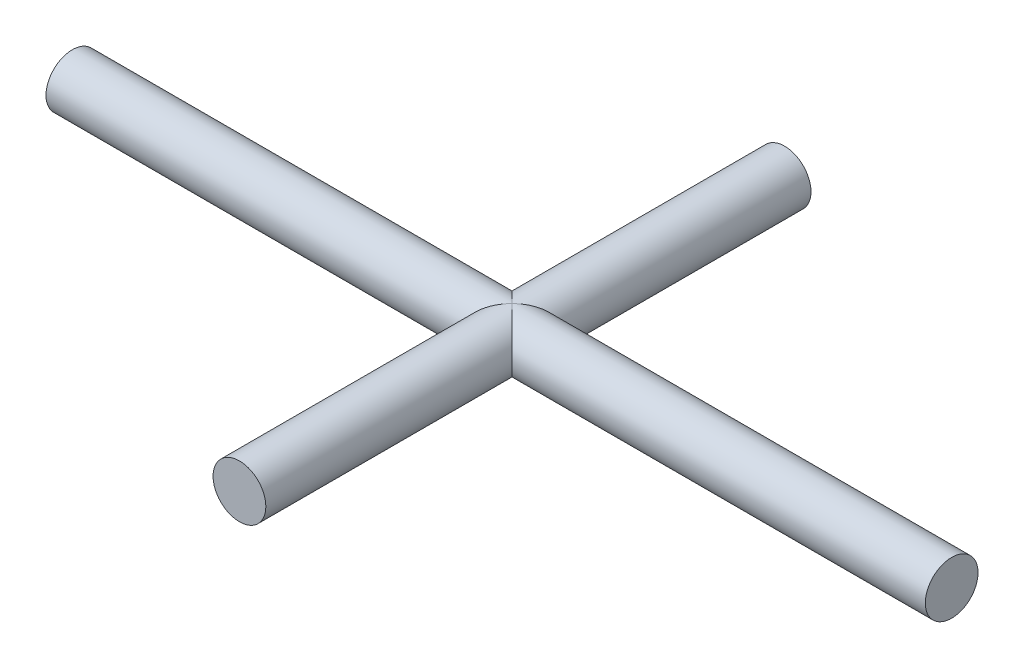
ISO-10303-21;
HEADER;
FILE_DESCRIPTION(('STEP AP214'),'2;1');
FILE_NAME('part.step','',(''),(''),'','','');
FILE_SCHEMA(('AUTOMOTIVE_DESIGN { 1 0 10303 214 1 1 1 1 }'));
ENDSEC;
DATA;
#1=APPLICATION_CONTEXT('core data for automotive mechanical design processes');
#2=APPLICATION_PROTOCOL_DEFINITION('international standard','automotive_design',2000,#1);
#3=PRODUCT_CONTEXT('',#1,'mechanical');
#4=PRODUCT('Part','Part','',(#3));
#5=PRODUCT_RELATED_PRODUCT_CATEGORY('part','',(#4));
#6=PRODUCT_DEFINITION_FORMATION('','',#4);
#7=PRODUCT_DEFINITION_CONTEXT('part definition',#1,'design');
#8=PRODUCT_DEFINITION('design','',#6,#7);
#9=PRODUCT_DEFINITION_SHAPE('','',#8);
#10=(LENGTH_UNIT() NAMED_UNIT(*) SI_UNIT(.MILLI.,.METRE.));
#11=(NAMED_UNIT(*) PLANE_ANGLE_UNIT() SI_UNIT($,.RADIAN.));
#12=(NAMED_UNIT(*) SI_UNIT($,.STERADIAN.) SOLID_ANGLE_UNIT());
#13=UNCERTAINTY_MEASURE_WITH_UNIT(LENGTH_MEASURE(1.E-05),#10,'distance_accuracy_value','');
#14=(GEOMETRIC_REPRESENTATION_CONTEXT(3) GLOBAL_UNCERTAINTY_ASSIGNED_CONTEXT((#13)) GLOBAL_UNIT_ASSIGNED_CONTEXT((#10,
#11,#12)) REPRESENTATION_CONTEXT('',''));
#15=CARTESIAN_POINT('',(0.,0.,0.));
#16=DIRECTION('',(0.,0.,1.));
#17=DIRECTION('',(1.,0.,0.));
#18=AXIS2_PLACEMENT_3D('',#15,#16,#17);
#19=CARTESIAN_POINT('',(-50.,0.,0.));
#20=DIRECTION('',(-1.,0.,0.));
#21=DIRECTION('',(0.,0.,1.));
#22=AXIS2_PLACEMENT_3D('',#19,#20,#21);
#23=CYLINDRICAL_SURFACE('',#22,3.00000000000001);
#24=CARTESIAN_POINT('',(50.,0.,0.));
#25=DIRECTION('',(-1.,0.,0.));
#26=DIRECTION('',(0.,0.,1.));
#27=AXIS2_PLACEMENT_3D('',#24,#25,#26);
#28=CIRCLE('',#27,3.00000000000001);
#29=CARTESIAN_POINT('',(50.,0.,3.00000000000001));
#30=VERTEX_POINT('',#29);
#31=EDGE_CURVE('E58',#30,#30,#28,.T.);
#32=ORIENTED_EDGE('',*,*,#31,.T.);
#33=EDGE_LOOP('',(#32));
#34=FACE_BOUND('',#33,.T.);
#35=CARTESIAN_POINT('',(0.,0.,0.));
#36=DIRECTION('',(-0.707106781186547,0.,0.707106781186547));
#37=DIRECTION('',(-0.707106781186547,0.,-0.707106781186547));
#38=AXIS2_PLACEMENT_3D('',#35,#36,#37);
#39=ELLIPSE('',#38,4.24264068711929,3.);
#40=CARTESIAN_POINT('',(0.,-3.,0.));
#41=VERTEX_POINT('',#40);
#42=CARTESIAN_POINT('',(0.,3.,0.));
#43=VERTEX_POINT('',#42);
#44=EDGE_CURVE('E41',#41,#43,#39,.T.);
#45=ORIENTED_EDGE('',*,*,#44,.F.);
#46=CARTESIAN_POINT('',(0.,0.,0.));
#47=DIRECTION('',(-0.707106781186547,0.,-0.707106781186547));
#48=DIRECTION('',(-0.707106781186547,0.,0.707106781186547));
#49=AXIS2_PLACEMENT_3D('',#46,#47,#48);
#50=ELLIPSE('',#49,4.24264068711929,3.);
#51=EDGE_CURVE('E53',#43,#41,#50,.T.);
#52=ORIENTED_EDGE('',*,*,#51,.F.);
#53=EDGE_LOOP('',(#45,#52));
#54=FACE_BOUND('',#53,.T.);
#55=ADVANCED_FACE('F33',(#34,#54),#23,.T.);
#56=CARTESIAN_POINT('',(50.,0.,0.));
#57=DIRECTION('',(-1.,0.,0.));
#58=DIRECTION('',(0.,0.,1.));
#59=AXIS2_PLACEMENT_3D('',#56,#57,#58);
#60=PLANE('',#59);
#61=ORIENTED_EDGE('',*,*,#31,.F.);
#62=EDGE_LOOP('',(#61));
#63=FACE_BOUND('',#62,.T.);
#64=ADVANCED_FACE('F80',(#63),#60,.F.);
#65=CARTESIAN_POINT('',(0.,0.,31.));
#66=DIRECTION('',(0.,0.,1.));
#67=DIRECTION('',(1.,0.,0.));
#68=AXIS2_PLACEMENT_3D('',#65,#66,#67);
#69=PLANE('',#68);
#70=CARTESIAN_POINT('',(0.,0.,31.));
#71=DIRECTION('',(0.,0.,1.));
#72=DIRECTION('',(1.,0.,0.));
#73=AXIS2_PLACEMENT_3D('',#70,#71,#72);
#74=CIRCLE('',#73,3.);
#75=CARTESIAN_POINT('',(3.,0.,31.));
#76=VERTEX_POINT('',#75);
#77=EDGE_CURVE('E95',#76,#76,#74,.T.);
#78=ORIENTED_EDGE('',*,*,#77,.T.);
#79=EDGE_LOOP('',(#78));
#80=FACE_BOUND('',#79,.T.);
#81=ADVANCED_FACE('F77',(#80),#69,.T.);
#82=CARTESIAN_POINT('',(0.,0.,31.));
#83=DIRECTION('',(0.,0.,1.));
#84=DIRECTION('',(1.,0.,0.));
#85=AXIS2_PLACEMENT_3D('',#82,#83,#84);
#86=CYLINDRICAL_SURFACE('',#85,3.);
#87=ORIENTED_EDGE('',*,*,#77,.F.);
#88=EDGE_LOOP('',(#87));
#89=FACE_BOUND('',#88,.T.);
#90=CARTESIAN_POINT('',(0.,0.,0.));
#91=DIRECTION('',(-0.707106781186547,0.,-0.707106781186547));
#92=DIRECTION('',(-0.707106781186547,0.,0.707106781186547));
#93=AXIS2_PLACEMENT_3D('',#90,#91,#92);
#94=ELLIPSE('',#93,4.24264068711929,3.);
#95=EDGE_CURVE('E47',#43,#41,#94,.F.);
#96=ORIENTED_EDGE('',*,*,#95,.T.);
#97=ORIENTED_EDGE('',*,*,#44,.T.);
#98=EDGE_LOOP('',(#96,#97));
#99=FACE_BOUND('',#98,.T.);
#100=ADVANCED_FACE('F60',(#89,#99),#86,.T.);
#101=CARTESIAN_POINT('',(-50.,0.,0.));
#102=DIRECTION('',(1.,0.,0.));
#103=DIRECTION('',(0.,0.,-1.));
#104=AXIS2_PLACEMENT_3D('',#101,#102,#103);
#105=PLANE('',#104);
#106=CARTESIAN_POINT('',(-50.,0.,0.));
#107=DIRECTION('',(-1.,0.,0.));
#108=DIRECTION('',(0.,0.,1.));
#109=AXIS2_PLACEMENT_3D('',#106,#107,#108);
#110=CIRCLE('',#109,3.);
#111=CARTESIAN_POINT('',(-50.,0.,3.));
#112=VERTEX_POINT('',#111);
#113=EDGE_CURVE('E88',#112,#112,#110,.T.);
#114=ORIENTED_EDGE('',*,*,#113,.T.);
#115=EDGE_LOOP('',(#114));
#116=FACE_BOUND('',#115,.T.);
#117=ADVANCED_FACE('F35',(#116),#105,.F.);
#118=ORIENTED_EDGE('',*,*,#113,.F.);
#119=EDGE_LOOP('',(#118));
#120=FACE_BOUND('',#119,.T.);
#121=CARTESIAN_POINT('',(0.,0.,0.));
#122=DIRECTION('',(-0.707106781186547,0.,0.707106781186547));
#123=DIRECTION('',(-0.707106781186547,0.,-0.707106781186547));
#124=AXIS2_PLACEMENT_3D('',#121,#122,#123);
#125=ELLIPSE('',#124,4.24264068711929,3.);
#126=EDGE_CURVE('E11',#41,#43,#125,.F.);
#127=ORIENTED_EDGE('',*,*,#126,.F.);
#128=ORIENTED_EDGE('',*,*,#95,.F.);
#129=EDGE_LOOP('',(#127,#128));
#130=FACE_BOUND('',#129,.T.);
#131=ADVANCED_FACE('F57',(#120,#130),#23,.T.);
#132=CARTESIAN_POINT('',(0.,0.,-31.));
#133=DIRECTION('',(0.,0.,1.));
#134=DIRECTION('',(1.,0.,0.));
#135=AXIS2_PLACEMENT_3D('',#132,#133,#134);
#136=CIRCLE('',#135,3.);
#137=CARTESIAN_POINT('',(3.,0.,-31.));
#138=VERTEX_POINT('',#137);
#139=EDGE_CURVE('E91',#138,#138,#136,.T.);
#140=ORIENTED_EDGE('',*,*,#139,.T.);
#141=EDGE_LOOP('',(#140));
#142=FACE_BOUND('',#141,.T.);
#143=ORIENTED_EDGE('',*,*,#51,.T.);
#144=ORIENTED_EDGE('',*,*,#126,.T.);
#145=EDGE_LOOP('',(#143,#144));
#146=FACE_BOUND('',#145,.T.);
#147=ADVANCED_FACE('F61',(#142,#146),#86,.T.);
#148=CARTESIAN_POINT('',(0.,0.,-31.));
#149=DIRECTION('',(0.,0.,1.));
#150=DIRECTION('',(1.,0.,0.));
#151=AXIS2_PLACEMENT_3D('',#148,#149,#150);
#152=PLANE('',#151);
#153=ORIENTED_EDGE('',*,*,#139,.F.);
#154=EDGE_LOOP('',(#153));
#155=FACE_BOUND('',#154,.T.);
#156=ADVANCED_FACE('F63',(#155),#152,.F.);
#157=CLOSED_SHELL('',(#55,#64,#81,#100,#117,#131,#147,#156));
#158=MANIFOLD_SOLID_BREP('B2',#157);
#159=ADVANCED_BREP_SHAPE_REPRESENTATION('',(#18,#158),#14);
#160=SHAPE_DEFINITION_REPRESENTATION(#9,#159);
ENDSEC;
END-ISO-10303-21;
